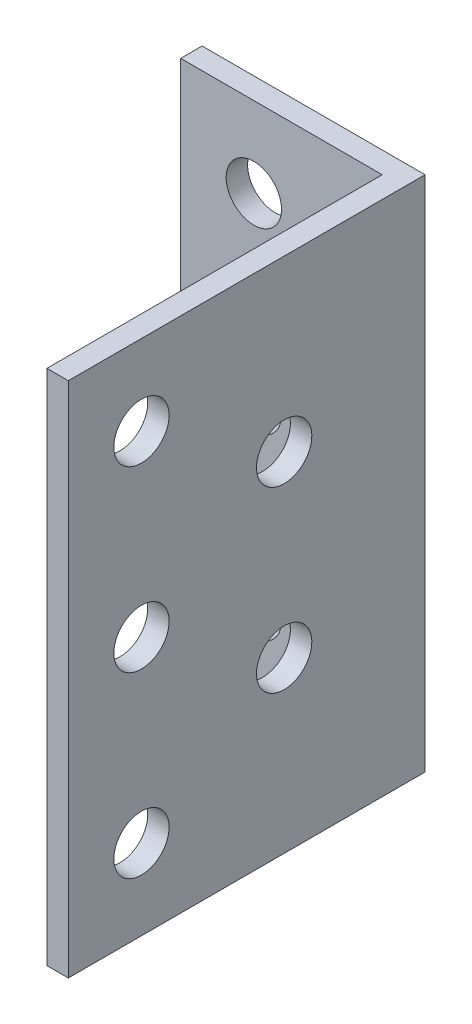
ISO-10303-21;
HEADER;
FILE_DESCRIPTION(('STEP AP214'),'2;1');
FILE_NAME('part.step','',(''),(''),'','','');
FILE_SCHEMA(('AUTOMOTIVE_DESIGN { 1 0 10303 214 1 1 1 1 }'));
ENDSEC;
DATA;
#1=APPLICATION_CONTEXT('core data for automotive mechanical design processes');
#2=APPLICATION_PROTOCOL_DEFINITION('international standard','automotive_design',2000,#1);
#3=PRODUCT_CONTEXT('',#1,'mechanical');
#4=PRODUCT('Part','Part','',(#3));
#5=PRODUCT_RELATED_PRODUCT_CATEGORY('part','',(#4));
#6=PRODUCT_DEFINITION_FORMATION('','',#4);
#7=PRODUCT_DEFINITION_CONTEXT('part definition',#1,'design');
#8=PRODUCT_DEFINITION('design','',#6,#7);
#9=PRODUCT_DEFINITION_SHAPE('','',#8);
#10=(LENGTH_UNIT() NAMED_UNIT(*) SI_UNIT(.MILLI.,.METRE.));
#11=(NAMED_UNIT(*) PLANE_ANGLE_UNIT() SI_UNIT($,.RADIAN.));
#12=(NAMED_UNIT(*) SI_UNIT($,.STERADIAN.) SOLID_ANGLE_UNIT());
#13=UNCERTAINTY_MEASURE_WITH_UNIT(LENGTH_MEASURE(1.E-05),#10,'distance_accuracy_value','');
#14=(GEOMETRIC_REPRESENTATION_CONTEXT(3) GLOBAL_UNCERTAINTY_ASSIGNED_CONTEXT((#13)) GLOBAL_UNIT_ASSIGNED_CONTEXT((#10,
#11,#12)) REPRESENTATION_CONTEXT('',''));
#15=CARTESIAN_POINT('',(0.,0.,0.));
#16=DIRECTION('',(0.,0.,1.));
#17=DIRECTION('',(1.,0.,0.));
#18=AXIS2_PLACEMENT_3D('',#15,#16,#17);
#19=CARTESIAN_POINT('',(0.,290.,12.));
#20=DIRECTION('',(0.,0.,-1.));
#21=DIRECTION('',(-1.,0.,0.));
#22=AXIS2_PLACEMENT_3D('',#19,#20,#21);
#23=PLANE('',#22);
#24=CARTESIAN_POINT('',(41.,245.,12.));
#25=DIRECTION('',(0.,0.,1.));
#26=DIRECTION('',(1.,0.,0.));
#27=AXIS2_PLACEMENT_3D('',#24,#25,#26);
#28=CIRCLE('',#27,15.5);
#29=CARTESIAN_POINT('',(56.5,245.,12.));
#30=VERTEX_POINT('',#29);
#31=EDGE_CURVE('E122',#30,#30,#28,.T.);
#32=ORIENTED_EDGE('',*,*,#31,.F.);
#33=EDGE_LOOP('',(#32));
#34=FACE_BOUND('',#33,.T.);
#35=CARTESIAN_POINT('',(41.,45.,12.));
#36=DIRECTION('',(0.,0.,1.));
#37=DIRECTION('',(1.,0.,0.));
#38=AXIS2_PLACEMENT_3D('',#35,#36,#37);
#39=CIRCLE('',#38,15.5);
#40=CARTESIAN_POINT('',(56.5,45.,12.));
#41=VERTEX_POINT('',#40);
#42=EDGE_CURVE('E96',#41,#41,#39,.T.);
#43=ORIENTED_EDGE('',*,*,#42,.F.);
#44=EDGE_LOOP('',(#43));
#45=FACE_BOUND('',#44,.T.);
#46=CARTESIAN_POINT('',(41.,145.,12.));
#47=DIRECTION('',(0.,0.,1.));
#48=DIRECTION('',(1.,0.,0.));
#49=AXIS2_PLACEMENT_3D('',#46,#47,#48);
#50=CIRCLE('',#49,15.5);
#51=CARTESIAN_POINT('',(56.5,145.,12.));
#52=VERTEX_POINT('',#51);
#53=EDGE_CURVE('E117',#52,#52,#50,.T.);
#54=ORIENTED_EDGE('',*,*,#53,.F.);
#55=EDGE_LOOP('',(#54));
#56=FACE_BOUND('',#55,.T.);
#57=DIRECTION('',(0.,-1.,0.));
#58=VECTOR('',#57,1.);
#59=CARTESIAN_POINT('',(113.,290.,12.));
#60=LINE('',#59,#58);
#61=CARTESIAN_POINT('',(113.,290.,12.));
#62=VERTEX_POINT('',#61);
#63=CARTESIAN_POINT('',(113.,0.,12.));
#64=VERTEX_POINT('',#63);
#65=EDGE_CURVE('E49',#62,#64,#60,.T.);
#66=ORIENTED_EDGE('',*,*,#65,.F.);
#67=DIRECTION('',(-1.,0.,0.));
#68=VECTOR('',#67,1.);
#69=CARTESIAN_POINT('',(0.,290.,12.));
#70=LINE('',#69,#68);
#71=CARTESIAN_POINT('',(0.,290.,12.));
#72=VERTEX_POINT('',#71);
#73=EDGE_CURVE('E54',#62,#72,#70,.T.);
#74=ORIENTED_EDGE('',*,*,#73,.T.);
#75=DIRECTION('',(0.,-1.,0.));
#76=VECTOR('',#75,1.);
#77=CARTESIAN_POINT('',(0.,0.,12.));
#78=LINE('',#77,#76);
#79=CARTESIAN_POINT('',(0.,0.,12.));
#80=VERTEX_POINT('',#79);
#81=EDGE_CURVE('E85',#72,#80,#78,.T.);
#82=ORIENTED_EDGE('',*,*,#81,.T.);
#83=DIRECTION('',(1.,0.,0.));
#84=VECTOR('',#83,1.);
#85=CARTESIAN_POINT('',(0.,0.,12.));
#86=LINE('',#85,#84);
#87=EDGE_CURVE('E110',#80,#64,#86,.T.);
#88=ORIENTED_EDGE('',*,*,#87,.T.);
#89=EDGE_LOOP('',(#66,#74,#82,#88));
#90=FACE_BOUND('',#89,.T.);
#91=ADVANCED_FACE('F32',(#34,#45,#56,#90),#23,.F.);
#92=CARTESIAN_POINT('',(0.,290.,0.));
#93=DIRECTION('',(0.,0.,-1.));
#94=DIRECTION('',(-1.,0.,0.));
#95=AXIS2_PLACEMENT_3D('',#92,#93,#94);
#96=PLANE('',#95);
#97=CARTESIAN_POINT('',(41.,145.,0.));
#98=DIRECTION('',(0.,0.,1.));
#99=DIRECTION('',(1.,0.,0.));
#100=AXIS2_PLACEMENT_3D('',#97,#98,#99);
#101=CIRCLE('',#100,15.5);
#102=CARTESIAN_POINT('',(56.5,145.,0.));
#103=VERTEX_POINT('',#102);
#104=EDGE_CURVE('E119',#103,#103,#101,.T.);
#105=ORIENTED_EDGE('',*,*,#104,.T.);
#106=EDGE_LOOP('',(#105));
#107=FACE_BOUND('',#106,.T.);
#108=DIRECTION('',(0.,-1.,0.));
#109=VECTOR('',#108,1.);
#110=CARTESIAN_POINT('',(0.,0.,0.));
#111=LINE('',#110,#109);
#112=CARTESIAN_POINT('',(0.,290.,0.));
#113=VERTEX_POINT('',#112);
#114=CARTESIAN_POINT('',(0.,0.,0.));
#115=VERTEX_POINT('',#114);
#116=EDGE_CURVE('E91',#113,#115,#111,.T.);
#117=ORIENTED_EDGE('',*,*,#116,.F.);
#118=DIRECTION('',(-1.,0.,0.));
#119=VECTOR('',#118,1.);
#120=CARTESIAN_POINT('',(0.,290.,0.));
#121=LINE('',#120,#119);
#122=CARTESIAN_POINT('',(125.,290.,0.));
#123=VERTEX_POINT('',#122);
#124=EDGE_CURVE('E74',#123,#113,#121,.T.);
#125=ORIENTED_EDGE('',*,*,#124,.F.);
#126=DIRECTION('',(0.,1.,0.));
#127=VECTOR('',#126,1.);
#128=CARTESIAN_POINT('',(125.,0.,0.));
#129=LINE('',#128,#127);
#130=CARTESIAN_POINT('',(125.,0.,0.));
#131=VERTEX_POINT('',#130);
#132=EDGE_CURVE('E86',#131,#123,#129,.T.);
#133=ORIENTED_EDGE('',*,*,#132,.F.);
#134=DIRECTION('',(1.,0.,0.));
#135=VECTOR('',#134,1.);
#136=CARTESIAN_POINT('',(0.,0.,0.));
#137=LINE('',#136,#135);
#138=EDGE_CURVE('E95',#115,#131,#137,.T.);
#139=ORIENTED_EDGE('',*,*,#138,.F.);
#140=EDGE_LOOP('',(#117,#125,#133,#139));
#141=FACE_BOUND('',#140,.T.);
#142=CARTESIAN_POINT('',(41.,45.,0.));
#143=DIRECTION('',(0.,0.,1.));
#144=DIRECTION('',(1.,0.,0.));
#145=AXIS2_PLACEMENT_3D('',#142,#143,#144);
#146=CIRCLE('',#145,15.5);
#147=CARTESIAN_POINT('',(56.5,45.,0.));
#148=VERTEX_POINT('',#147);
#149=EDGE_CURVE('E100',#148,#148,#146,.T.);
#150=ORIENTED_EDGE('',*,*,#149,.T.);
#151=EDGE_LOOP('',(#150));
#152=FACE_BOUND('',#151,.T.);
#153=CARTESIAN_POINT('',(41.,245.,0.));
#154=DIRECTION('',(0.,0.,1.));
#155=DIRECTION('',(1.,0.,0.));
#156=AXIS2_PLACEMENT_3D('',#153,#154,#155);
#157=CIRCLE('',#156,15.5);
#158=CARTESIAN_POINT('',(56.5,245.,0.));
#159=VERTEX_POINT('',#158);
#160=EDGE_CURVE('E125',#159,#159,#157,.T.);
#161=ORIENTED_EDGE('',*,*,#160,.T.);
#162=EDGE_LOOP('',(#161));
#163=FACE_BOUND('',#162,.T.);
#164=ADVANCED_FACE('F93',(#107,#141,#152,#163),#96,.T.);
#165=CARTESIAN_POINT('',(0.,0.,12.));
#166=DIRECTION('',(1.,0.,0.));
#167=DIRECTION('',(0.,0.,-1.));
#168=AXIS2_PLACEMENT_3D('',#165,#166,#167);
#169=PLANE('',#168);
#170=ORIENTED_EDGE('',*,*,#116,.T.);
#171=DIRECTION('',(0.,0.,-1.));
#172=VECTOR('',#171,1.);
#173=CARTESIAN_POINT('',(0.,0.,12.));
#174=LINE('',#173,#172);
#175=EDGE_CURVE('E11',#80,#115,#174,.T.);
#176=ORIENTED_EDGE('',*,*,#175,.F.);
#177=ORIENTED_EDGE('',*,*,#81,.F.);
#178=DIRECTION('',(0.,0.,-1.));
#179=VECTOR('',#178,1.);
#180=CARTESIAN_POINT('',(0.,290.,12.));
#181=LINE('',#180,#179);
#182=EDGE_CURVE('E77',#72,#113,#181,.T.);
#183=ORIENTED_EDGE('',*,*,#182,.T.);
#184=EDGE_LOOP('',(#170,#176,#177,#183));
#185=FACE_BOUND('',#184,.T.);
#186=ADVANCED_FACE('F34',(#185),#169,.F.);
#187=CARTESIAN_POINT('',(0.,0.,12.));
#188=DIRECTION('',(0.,1.,0.));
#189=DIRECTION('',(0.,0.,1.));
#190=AXIS2_PLACEMENT_3D('',#187,#188,#189);
#191=PLANE('',#190);
#192=ORIENTED_EDGE('',*,*,#138,.T.);
#193=DIRECTION('',(0.,0.,-1.));
#194=VECTOR('',#193,1.);
#195=CARTESIAN_POINT('',(125.,0.,12.));
#196=LINE('',#195,#194);
#197=CARTESIAN_POINT('',(125.,0.,200.));
#198=VERTEX_POINT('',#197);
#199=EDGE_CURVE('E41',#198,#131,#196,.T.);
#200=ORIENTED_EDGE('',*,*,#199,.F.);
#201=DIRECTION('',(1.,0.,0.));
#202=VECTOR('',#201,1.);
#203=CARTESIAN_POINT('',(125.,0.,200.));
#204=LINE('',#203,#202);
#205=CARTESIAN_POINT('',(113.,0.,200.));
#206=VERTEX_POINT('',#205);
#207=EDGE_CURVE('E133',#206,#198,#204,.T.);
#208=ORIENTED_EDGE('',*,*,#207,.F.);
#209=DIRECTION('',(0.,0.,-1.));
#210=VECTOR('',#209,1.);
#211=CARTESIAN_POINT('',(113.,0.,200.));
#212=LINE('',#211,#210);
#213=EDGE_CURVE('E138',#206,#64,#212,.T.);
#214=ORIENTED_EDGE('',*,*,#213,.T.);
#215=ORIENTED_EDGE('',*,*,#87,.F.);
#216=ORIENTED_EDGE('',*,*,#175,.T.);
#217=EDGE_LOOP('',(#192,#200,#208,#214,#215,#216));
#218=FACE_BOUND('',#217,.T.);
#219=ADVANCED_FACE('F164',(#218),#191,.F.);
#220=CARTESIAN_POINT('',(125.,0.,12.));
#221=DIRECTION('',(-1.,0.,0.));
#222=DIRECTION('',(0.,0.,1.));
#223=AXIS2_PLACEMENT_3D('',#220,#221,#222);
#224=PLANE('',#223);
#225=CARTESIAN_POINT('',(125.,195.,79.));
#226=DIRECTION('',(-1.,0.,0.));
#227=DIRECTION('',(0.,0.,1.));
#228=AXIS2_PLACEMENT_3D('',#225,#226,#227);
#229=CIRCLE('',#228,15.5);
#230=CARTESIAN_POINT('',(125.,195.,94.5));
#231=VERTEX_POINT('',#230);
#232=EDGE_CURVE('E194',#231,#231,#229,.T.);
#233=ORIENTED_EDGE('',*,*,#232,.T.);
#234=EDGE_LOOP('',(#233));
#235=FACE_BOUND('',#234,.T.);
#236=CARTESIAN_POINT('',(125.,95.,79.));
#237=DIRECTION('',(-1.,0.,0.));
#238=DIRECTION('',(0.,0.,1.));
#239=AXIS2_PLACEMENT_3D('',#236,#237,#238);
#240=CIRCLE('',#239,15.5);
#241=CARTESIAN_POINT('',(125.,95.,94.5));
#242=VERTEX_POINT('',#241);
#243=EDGE_CURVE('E188',#242,#242,#240,.T.);
#244=ORIENTED_EDGE('',*,*,#243,.T.);
#245=EDGE_LOOP('',(#244));
#246=FACE_BOUND('',#245,.T.);
#247=CARTESIAN_POINT('',(125.,245.,159.));
#248=DIRECTION('',(-1.,0.,0.));
#249=DIRECTION('',(0.,0.,1.));
#250=AXIS2_PLACEMENT_3D('',#247,#248,#249);
#251=CIRCLE('',#250,15.5);
#252=CARTESIAN_POINT('',(125.,245.,174.5));
#253=VERTEX_POINT('',#252);
#254=EDGE_CURVE('E182',#253,#253,#251,.T.);
#255=ORIENTED_EDGE('',*,*,#254,.T.);
#256=EDGE_LOOP('',(#255));
#257=FACE_BOUND('',#256,.T.);
#258=CARTESIAN_POINT('',(125.,145.,159.));
#259=DIRECTION('',(-1.,0.,0.));
#260=DIRECTION('',(0.,0.,1.));
#261=AXIS2_PLACEMENT_3D('',#258,#259,#260);
#262=CIRCLE('',#261,15.5);
#263=CARTESIAN_POINT('',(125.,145.,174.5));
#264=VERTEX_POINT('',#263);
#265=EDGE_CURVE('E176',#264,#264,#262,.T.);
#266=ORIENTED_EDGE('',*,*,#265,.T.);
#267=EDGE_LOOP('',(#266));
#268=FACE_BOUND('',#267,.T.);
#269=CARTESIAN_POINT('',(125.,45.,159.));
#270=DIRECTION('',(-1.,0.,0.));
#271=DIRECTION('',(0.,0.,1.));
#272=AXIS2_PLACEMENT_3D('',#269,#270,#271);
#273=CIRCLE('',#272,15.5);
#274=CARTESIAN_POINT('',(125.,45.,174.5));
#275=VERTEX_POINT('',#274);
#276=EDGE_CURVE('E137',#275,#275,#273,.T.);
#277=ORIENTED_EDGE('',*,*,#276,.T.);
#278=EDGE_LOOP('',(#277));
#279=FACE_BOUND('',#278,.T.);
#280=ORIENTED_EDGE('',*,*,#132,.T.);
#281=DIRECTION('',(0.,0.,-1.));
#282=VECTOR('',#281,1.);
#283=CARTESIAN_POINT('',(125.,290.,12.));
#284=LINE('',#283,#282);
#285=CARTESIAN_POINT('',(125.,290.,200.));
#286=VERTEX_POINT('',#285);
#287=EDGE_CURVE('E81',#286,#123,#284,.T.);
#288=ORIENTED_EDGE('',*,*,#287,.F.);
#289=DIRECTION('',(0.,1.,0.));
#290=VECTOR('',#289,1.);
#291=CARTESIAN_POINT('',(125.,290.,200.));
#292=LINE('',#291,#290);
#293=EDGE_CURVE('E136',#198,#286,#292,.T.);
#294=ORIENTED_EDGE('',*,*,#293,.F.);
#295=ORIENTED_EDGE('',*,*,#199,.T.);
#296=EDGE_LOOP('',(#280,#288,#294,#295));
#297=FACE_BOUND('',#296,.T.);
#298=ADVANCED_FACE('F224',(#235,#246,#257,#268,#279,#297),#224,.F.);
#299=CARTESIAN_POINT('',(0.,290.,12.));
#300=DIRECTION('',(0.,-1.,0.));
#301=DIRECTION('',(0.,0.,-1.));
#302=AXIS2_PLACEMENT_3D('',#299,#300,#301);
#303=PLANE('',#302);
#304=ORIENTED_EDGE('',*,*,#124,.T.);
#305=ORIENTED_EDGE('',*,*,#182,.F.);
#306=ORIENTED_EDGE('',*,*,#73,.F.);
#307=DIRECTION('',(0.,0.,-1.));
#308=VECTOR('',#307,1.);
#309=CARTESIAN_POINT('',(113.,290.,200.));
#310=LINE('',#309,#308);
#311=CARTESIAN_POINT('',(113.,290.,200.));
#312=VERTEX_POINT('',#311);
#313=EDGE_CURVE('E128',#312,#62,#310,.T.);
#314=ORIENTED_EDGE('',*,*,#313,.F.);
#315=DIRECTION('',(-1.,0.,0.));
#316=VECTOR('',#315,1.);
#317=CARTESIAN_POINT('',(125.,290.,200.));
#318=LINE('',#317,#316);
#319=EDGE_CURVE('E154',#286,#312,#318,.T.);
#320=ORIENTED_EDGE('',*,*,#319,.F.);
#321=ORIENTED_EDGE('',*,*,#287,.T.);
#322=EDGE_LOOP('',(#304,#305,#306,#314,#320,#321));
#323=FACE_BOUND('',#322,.T.);
#324=ADVANCED_FACE('F76',(#323),#303,.F.);
#325=CARTESIAN_POINT('',(41.,45.,12.));
#326=DIRECTION('',(0.,0.,-1.));
#327=DIRECTION('',(-1.,0.,0.));
#328=AXIS2_PLACEMENT_3D('',#325,#326,#327);
#329=CYLINDRICAL_SURFACE('',#328,15.5);
#330=ORIENTED_EDGE('',*,*,#42,.T.);
#331=EDGE_LOOP('',(#330));
#332=FACE_BOUND('',#331,.T.);
#333=ORIENTED_EDGE('',*,*,#149,.F.);
#334=EDGE_LOOP('',(#333));
#335=FACE_BOUND('',#334,.T.);
#336=ADVANCED_FACE('F244',(#332,#335),#329,.F.);
#337=CARTESIAN_POINT('',(41.,145.,12.));
#338=DIRECTION('',(0.,0.,-1.));
#339=DIRECTION('',(-1.,0.,0.));
#340=AXIS2_PLACEMENT_3D('',#337,#338,#339);
#341=CYLINDRICAL_SURFACE('',#340,15.5);
#342=ORIENTED_EDGE('',*,*,#53,.T.);
#343=EDGE_LOOP('',(#342));
#344=FACE_BOUND('',#343,.T.);
#345=ORIENTED_EDGE('',*,*,#104,.F.);
#346=EDGE_LOOP('',(#345));
#347=FACE_BOUND('',#346,.T.);
#348=ADVANCED_FACE('F292',(#344,#347),#341,.F.);
#349=CARTESIAN_POINT('',(41.,245.,12.));
#350=DIRECTION('',(0.,0.,-1.));
#351=DIRECTION('',(-1.,0.,0.));
#352=AXIS2_PLACEMENT_3D('',#349,#350,#351);
#353=CYLINDRICAL_SURFACE('',#352,15.5);
#354=ORIENTED_EDGE('',*,*,#31,.T.);
#355=EDGE_LOOP('',(#354));
#356=FACE_BOUND('',#355,.T.);
#357=ORIENTED_EDGE('',*,*,#160,.F.);
#358=EDGE_LOOP('',(#357));
#359=FACE_BOUND('',#358,.T.);
#360=ADVANCED_FACE('F207',(#356,#359),#353,.F.);
#361=CARTESIAN_POINT('',(113.,290.,200.));
#362=DIRECTION('',(1.,0.,0.));
#363=DIRECTION('',(0.,1.,0.));
#364=AXIS2_PLACEMENT_3D('',#361,#362,#363);
#365=PLANE('',#364);
#366=CARTESIAN_POINT('',(113.,195.,79.));
#367=DIRECTION('',(-1.,0.,0.));
#368=DIRECTION('',(0.,-1.,0.));
#369=AXIS2_PLACEMENT_3D('',#366,#367,#368);
#370=CIRCLE('',#369,15.5);
#371=CARTESIAN_POINT('',(113.,179.5,79.));
#372=VERTEX_POINT('',#371);
#373=EDGE_CURVE('E197',#372,#372,#370,.T.);
#374=ORIENTED_EDGE('',*,*,#373,.F.);
#375=EDGE_LOOP('',(#374));
#376=FACE_BOUND('',#375,.T.);
#377=CARTESIAN_POINT('',(113.,95.,79.));
#378=DIRECTION('',(-1.,0.,0.));
#379=DIRECTION('',(0.,-1.,0.));
#380=AXIS2_PLACEMENT_3D('',#377,#378,#379);
#381=CIRCLE('',#380,15.5);
#382=CARTESIAN_POINT('',(113.,79.5,79.));
#383=VERTEX_POINT('',#382);
#384=EDGE_CURVE('E191',#383,#383,#381,.T.);
#385=ORIENTED_EDGE('',*,*,#384,.F.);
#386=EDGE_LOOP('',(#385));
#387=FACE_BOUND('',#386,.T.);
#388=CARTESIAN_POINT('',(113.,245.,159.));
#389=DIRECTION('',(-1.,0.,0.));
#390=DIRECTION('',(0.,-1.,0.));
#391=AXIS2_PLACEMENT_3D('',#388,#389,#390);
#392=CIRCLE('',#391,15.5);
#393=CARTESIAN_POINT('',(113.,229.5,159.));
#394=VERTEX_POINT('',#393);
#395=EDGE_CURVE('E185',#394,#394,#392,.T.);
#396=ORIENTED_EDGE('',*,*,#395,.F.);
#397=EDGE_LOOP('',(#396));
#398=FACE_BOUND('',#397,.T.);
#399=CARTESIAN_POINT('',(113.,145.,159.));
#400=DIRECTION('',(-1.,0.,0.));
#401=DIRECTION('',(0.,-1.,0.));
#402=AXIS2_PLACEMENT_3D('',#399,#400,#401);
#403=CIRCLE('',#402,15.5);
#404=CARTESIAN_POINT('',(113.,129.5,159.));
#405=VERTEX_POINT('',#404);
#406=EDGE_CURVE('E179',#405,#405,#403,.T.);
#407=ORIENTED_EDGE('',*,*,#406,.F.);
#408=EDGE_LOOP('',(#407));
#409=FACE_BOUND('',#408,.T.);
#410=CARTESIAN_POINT('',(113.,45.,159.));
#411=DIRECTION('',(-1.,0.,0.));
#412=DIRECTION('',(0.,-1.,0.));
#413=AXIS2_PLACEMENT_3D('',#410,#411,#412);
#414=CIRCLE('',#413,15.5);
#415=CARTESIAN_POINT('',(113.,29.5,159.));
#416=VERTEX_POINT('',#415);
#417=EDGE_CURVE('E173',#416,#416,#414,.T.);
#418=ORIENTED_EDGE('',*,*,#417,.F.);
#419=EDGE_LOOP('',(#418));
#420=FACE_BOUND('',#419,.T.);
#421=ORIENTED_EDGE('',*,*,#65,.T.);
#422=ORIENTED_EDGE('',*,*,#213,.F.);
#423=DIRECTION('',(0.,-1.,0.));
#424=VECTOR('',#423,1.);
#425=CARTESIAN_POINT('',(113.,290.,200.));
#426=LINE('',#425,#424);
#427=EDGE_CURVE('E151',#312,#206,#426,.T.);
#428=ORIENTED_EDGE('',*,*,#427,.F.);
#429=ORIENTED_EDGE('',*,*,#313,.T.);
#430=EDGE_LOOP('',(#421,#422,#428,#429));
#431=FACE_BOUND('',#430,.T.);
#432=ADVANCED_FACE('F146',(#376,#387,#398,#409,#420,#431),#365,.F.);
#433=CARTESIAN_POINT('',(125.,0.,200.));
#434=DIRECTION('',(0.,0.,-1.));
#435=DIRECTION('',(-1.,0.,0.));
#436=AXIS2_PLACEMENT_3D('',#433,#434,#435);
#437=PLANE('',#436);
#438=ORIENTED_EDGE('',*,*,#293,.T.);
#439=ORIENTED_EDGE('',*,*,#319,.T.);
#440=ORIENTED_EDGE('',*,*,#427,.T.);
#441=ORIENTED_EDGE('',*,*,#207,.T.);
#442=EDGE_LOOP('',(#438,#439,#440,#441));
#443=FACE_BOUND('',#442,.T.);
#444=ADVANCED_FACE('F206',(#443),#437,.F.);
#445=CARTESIAN_POINT('',(301.,45.,159.));
#446=DIRECTION('',(-1.,0.,0.));
#447=DIRECTION('',(0.,-1.,0.));
#448=AXIS2_PLACEMENT_3D('',#445,#446,#447);
#449=CYLINDRICAL_SURFACE('',#448,15.5);
#450=ORIENTED_EDGE('',*,*,#417,.T.);
#451=EDGE_LOOP('',(#450));
#452=FACE_BOUND('',#451,.T.);
#453=ORIENTED_EDGE('',*,*,#276,.F.);
#454=EDGE_LOOP('',(#453));
#455=FACE_BOUND('',#454,.T.);
#456=ADVANCED_FACE('F217',(#452,#455),#449,.F.);
#457=CARTESIAN_POINT('',(301.,145.,159.));
#458=DIRECTION('',(-1.,0.,0.));
#459=DIRECTION('',(0.,-1.,0.));
#460=AXIS2_PLACEMENT_3D('',#457,#458,#459);
#461=CYLINDRICAL_SURFACE('',#460,15.5);
#462=ORIENTED_EDGE('',*,*,#406,.T.);
#463=EDGE_LOOP('',(#462));
#464=FACE_BOUND('',#463,.T.);
#465=ORIENTED_EDGE('',*,*,#265,.F.);
#466=EDGE_LOOP('',(#465));
#467=FACE_BOUND('',#466,.T.);
#468=ADVANCED_FACE('F220',(#464,#467),#461,.F.);
#469=CARTESIAN_POINT('',(301.,245.,159.));
#470=DIRECTION('',(-1.,0.,0.));
#471=DIRECTION('',(0.,-1.,0.));
#472=AXIS2_PLACEMENT_3D('',#469,#470,#471);
#473=CYLINDRICAL_SURFACE('',#472,15.5);
#474=ORIENTED_EDGE('',*,*,#395,.T.);
#475=EDGE_LOOP('',(#474));
#476=FACE_BOUND('',#475,.T.);
#477=ORIENTED_EDGE('',*,*,#254,.F.);
#478=EDGE_LOOP('',(#477));
#479=FACE_BOUND('',#478,.T.);
#480=ADVANCED_FACE('F337',(#476,#479),#473,.F.);
#481=CARTESIAN_POINT('',(301.,95.,79.));
#482=DIRECTION('',(-1.,0.,0.));
#483=DIRECTION('',(0.,-1.,0.));
#484=AXIS2_PLACEMENT_3D('',#481,#482,#483);
#485=CYLINDRICAL_SURFACE('',#484,15.5);
#486=ORIENTED_EDGE('',*,*,#384,.T.);
#487=EDGE_LOOP('',(#486));
#488=FACE_BOUND('',#487,.T.);
#489=ORIENTED_EDGE('',*,*,#243,.F.);
#490=EDGE_LOOP('',(#489));
#491=FACE_BOUND('',#490,.T.);
#492=ADVANCED_FACE('F347',(#488,#491),#485,.F.);
#493=CARTESIAN_POINT('',(301.,195.,79.));
#494=DIRECTION('',(-1.,0.,0.));
#495=DIRECTION('',(0.,-1.,0.));
#496=AXIS2_PLACEMENT_3D('',#493,#494,#495);
#497=CYLINDRICAL_SURFACE('',#496,15.5);
#498=ORIENTED_EDGE('',*,*,#373,.T.);
#499=EDGE_LOOP('',(#498));
#500=FACE_BOUND('',#499,.T.);
#501=ORIENTED_EDGE('',*,*,#232,.F.);
#502=EDGE_LOOP('',(#501));
#503=FACE_BOUND('',#502,.T.);
#504=ADVANCED_FACE('F201',(#500,#503),#497,.F.);
#505=CLOSED_SHELL('',(#91,#164,#186,#219,#298,#324,#336,#348,#360,#432,#444,#456,#468,#480,#492,#504));
#506=MANIFOLD_SOLID_BREP('B2',#505);
#507=ADVANCED_BREP_SHAPE_REPRESENTATION('',(#18,#506),#14);
#508=SHAPE_DEFINITION_REPRESENTATION(#9,#507);
ENDSEC;
END-ISO-10303-21;
